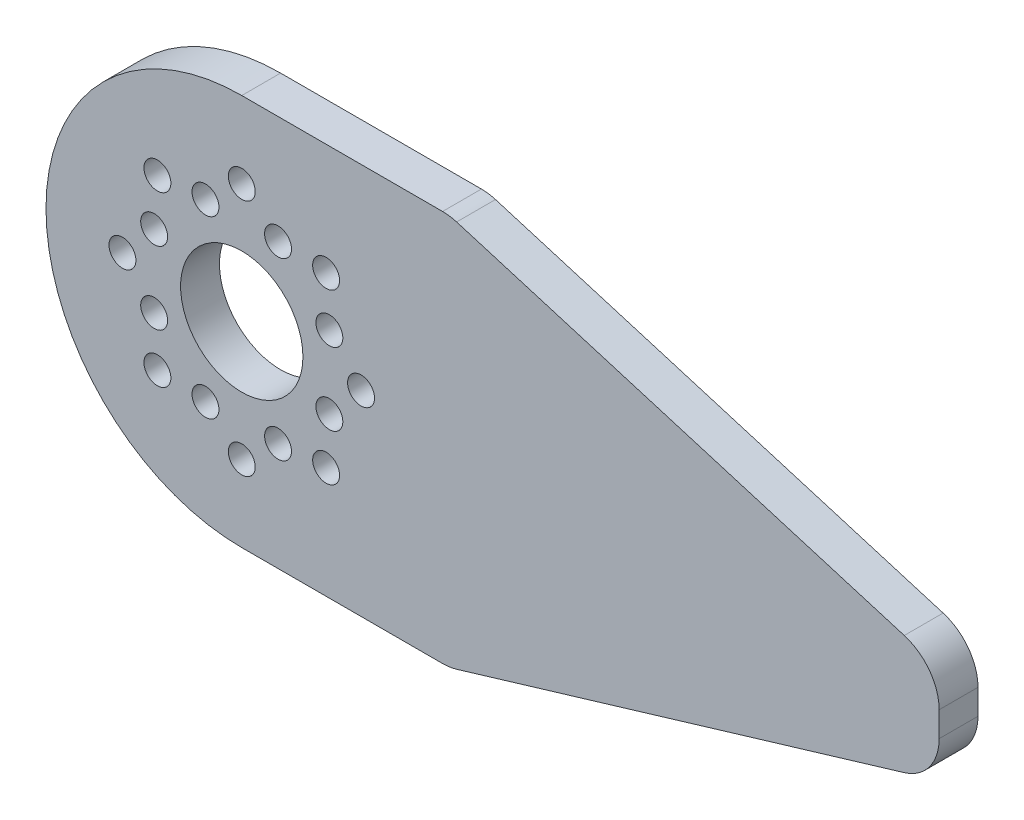
ISO-10303-21;
HEADER;
FILE_DESCRIPTION(('STEP AP214'),'2;1');
FILE_NAME('part.step','',(''),(''),'','','');
FILE_SCHEMA(('AUTOMOTIVE_DESIGN { 1 0 10303 214 1 1 1 1 }'));
ENDSEC;
DATA;
#1=APPLICATION_CONTEXT('core data for automotive mechanical design processes');
#2=APPLICATION_PROTOCOL_DEFINITION('international standard','automotive_design',2000,#1);
#3=PRODUCT_CONTEXT('',#1,'mechanical');
#4=PRODUCT('Part','Part','',(#3));
#5=PRODUCT_RELATED_PRODUCT_CATEGORY('part','',(#4));
#6=PRODUCT_DEFINITION_FORMATION('','',#4);
#7=PRODUCT_DEFINITION_CONTEXT('part definition',#1,'design');
#8=PRODUCT_DEFINITION('design','',#6,#7);
#9=PRODUCT_DEFINITION_SHAPE('','',#8);
#10=(LENGTH_UNIT() NAMED_UNIT(*) SI_UNIT(.MILLI.,.METRE.));
#11=(NAMED_UNIT(*) PLANE_ANGLE_UNIT() SI_UNIT($,.RADIAN.));
#12=(NAMED_UNIT(*) SI_UNIT($,.STERADIAN.) SOLID_ANGLE_UNIT());
#13=UNCERTAINTY_MEASURE_WITH_UNIT(LENGTH_MEASURE(1.E-05),#10,'distance_accuracy_value','');
#14=(GEOMETRIC_REPRESENTATION_CONTEXT(3) GLOBAL_UNCERTAINTY_ASSIGNED_CONTEXT((#13)) GLOBAL_UNIT_ASSIGNED_CONTEXT((#10,
#11,#12)) REPRESENTATION_CONTEXT('',''));
#15=CARTESIAN_POINT('',(0.,0.,0.));
#16=DIRECTION('',(0.,0.,1.));
#17=DIRECTION('',(1.,0.,0.));
#18=AXIS2_PLACEMENT_3D('',#15,#16,#17);
#19=CARTESIAN_POINT('',(19.,16.,3.175));
#20=DIRECTION('',(0.,0.,1.));
#21=DIRECTION('',(1.,0.,0.));
#22=AXIS2_PLACEMENT_3D('',#19,#20,#21);
#23=PLANE('',#22);
#24=DIRECTION('',(0.957826285221151,-0.287347885566345,0.));
#25=VECTOR('',#24,1.);
#26=CARTESIAN_POINT('',(76.,20.,3.175));
#27=LINE('',#26,#25);
#28=CARTESIAN_POINT('',(36.5623161970513,31.8313051408846,3.175));
#29=VERTEX_POINT('',#28);
#30=CARTESIAN_POINT('',(73.1493915422654,20.8551825373204,3.175));
#31=VERTEX_POINT('',#30);
#32=EDGE_CURVE('E198',#29,#31,#27,.T.);
#33=ORIENTED_EDGE('',*,*,#32,.F.);
#34=CARTESIAN_POINT('',(35.4129246547859,28.,3.175));
#35=DIRECTION('',(0.,0.,1.));
#36=DIRECTION('',(1.,0.,0.));
#37=AXIS2_PLACEMENT_3D('',#34,#35,#36);
#38=CIRCLE('',#37,4.);
#39=CARTESIAN_POINT('',(35.4129246547859,32.,3.175));
#40=VERTEX_POINT('',#39);
#41=EDGE_CURVE('E120',#29,#40,#38,.T.);
#42=ORIENTED_EDGE('',*,*,#41,.T.);
#43=DIRECTION('',(-1.,0.,0.));
#44=VECTOR('',#43,1.);
#45=CARTESIAN_POINT('',(19.,32.,3.175));
#46=LINE('',#45,#44);
#47=CARTESIAN_POINT('',(19.,32.,3.175));
#48=VERTEX_POINT('',#47);
#49=EDGE_CURVE('E112',#40,#48,#46,.T.);
#50=ORIENTED_EDGE('',*,*,#49,.T.);
#51=CARTESIAN_POINT('',(19.,16.,3.175));
#52=DIRECTION('',(0.,0.,1.));
#53=DIRECTION('',(1.,0.,0.));
#54=AXIS2_PLACEMENT_3D('',#51,#52,#53);
#55=CIRCLE('',#54,16.);
#56=CARTESIAN_POINT('',(19.,0.,3.175));
#57=VERTEX_POINT('',#56);
#58=EDGE_CURVE('E118',#48,#57,#55,.T.);
#59=ORIENTED_EDGE('',*,*,#58,.T.);
#60=DIRECTION('',(1.,0.,0.));
#61=VECTOR('',#60,1.);
#62=CARTESIAN_POINT('',(19.,0.,3.175));
#63=LINE('',#62,#61);
#64=CARTESIAN_POINT('',(35.4129246547859,0.,3.175));
#65=VERTEX_POINT('',#64);
#66=EDGE_CURVE('E138',#57,#65,#63,.T.);
#67=ORIENTED_EDGE('',*,*,#66,.T.);
#68=CARTESIAN_POINT('',(35.4129246547859,4.,3.175));
#69=DIRECTION('',(0.,0.,1.));
#70=DIRECTION('',(1.,0.,0.));
#71=AXIS2_PLACEMENT_3D('',#68,#69,#70);
#72=CIRCLE('',#71,4.);
#73=CARTESIAN_POINT('',(36.5623161970513,0.168694859115396,3.175));
#74=VERTEX_POINT('',#73);
#75=EDGE_CURVE('E161',#65,#74,#72,.T.);
#76=ORIENTED_EDGE('',*,*,#75,.T.);
#77=DIRECTION('',(-0.957826285221151,-0.287347885566345,0.));
#78=VECTOR('',#77,1.);
#79=CARTESIAN_POINT('',(76.,12.,3.175));
#80=LINE('',#79,#78);
#81=CARTESIAN_POINT('',(73.1493915422654,11.1448174626796,3.175));
#82=VERTEX_POINT('',#81);
#83=EDGE_CURVE('E195',#82,#74,#80,.T.);
#84=ORIENTED_EDGE('',*,*,#83,.F.);
#85=CARTESIAN_POINT('',(72.,14.9761226035642,3.175));
#86=DIRECTION('',(0.,0.,1.));
#87=DIRECTION('',(1.,0.,0.));
#88=AXIS2_PLACEMENT_3D('',#85,#86,#87);
#89=CIRCLE('',#88,4.);
#90=CARTESIAN_POINT('',(76.,14.9761226035642,3.175));
#91=VERTEX_POINT('',#90);
#92=EDGE_CURVE('E157',#82,#91,#89,.T.);
#93=ORIENTED_EDGE('',*,*,#92,.T.);
#94=DIRECTION('',(0.,1.,0.));
#95=VECTOR('',#94,1.);
#96=CARTESIAN_POINT('',(76.,0.,3.175));
#97=LINE('',#96,#95);
#98=CARTESIAN_POINT('',(76.,17.0238773964358,3.175));
#99=VERTEX_POINT('',#98);
#100=EDGE_CURVE('E123',#91,#99,#97,.T.);
#101=ORIENTED_EDGE('',*,*,#100,.T.);
#102=CARTESIAN_POINT('',(72.,17.0238773964358,3.175));
#103=DIRECTION('',(0.,0.,1.));
#104=DIRECTION('',(1.,0.,0.));
#105=AXIS2_PLACEMENT_3D('',#102,#103,#104);
#106=CIRCLE('',#105,4.);
#107=EDGE_CURVE('E159',#99,#31,#106,.T.);
#108=ORIENTED_EDGE('',*,*,#107,.T.);
#109=EDGE_LOOP('',(#33,#42,#50,#59,#67,#76,#84,#93,#101,#108));
#110=FACE_BOUND('',#109,.T.);
#111=CARTESIAN_POINT('',(11.8399336230385,18.9657966008286,3.175));
#112=DIRECTION('',(0.,0.,1.));
#113=DIRECTION('',(1.,0.,0.));
#114=AXIS2_PLACEMENT_3D('',#111,#112,#113);
#115=CIRCLE('',#114,1.1);
#116=CARTESIAN_POINT('',(12.9399336230385,18.9657966008286,3.175));
#117=VERTEX_POINT('',#116);
#118=EDGE_CURVE('E212',#117,#117,#115,.T.);
#119=ORIENTED_EDGE('',*,*,#118,.F.);
#120=EDGE_LOOP('',(#119));
#121=FACE_BOUND('',#120,.T.);
#122=CARTESIAN_POINT('',(16.0342033991723,8.83993362303764,3.175));
#123=DIRECTION('',(0.,0.,1.));
#124=DIRECTION('',(1.,0.,0.));
#125=AXIS2_PLACEMENT_3D('',#122,#123,#124);
#126=CIRCLE('',#125,1.1);
#127=CARTESIAN_POINT('',(17.1342033991723,8.83993362303764,3.175));
#128=VERTEX_POINT('',#127);
#129=EDGE_CURVE('E224',#128,#128,#126,.T.);
#130=ORIENTED_EDGE('',*,*,#129,.F.);
#131=EDGE_LOOP('',(#130));
#132=FACE_BOUND('',#131,.T.);
#133=CARTESIAN_POINT('',(26.1600663769633,13.0342033991715,3.175));
#134=DIRECTION('',(0.,0.,1.));
#135=DIRECTION('',(1.,0.,0.));
#136=AXIS2_PLACEMENT_3D('',#133,#134,#135);
#137=CIRCLE('',#136,1.1);
#138=CARTESIAN_POINT('',(27.2600663769633,13.0342033991715,3.175));
#139=VERTEX_POINT('',#138);
#140=EDGE_CURVE('E236',#139,#139,#137,.T.);
#141=ORIENTED_EDGE('',*,*,#140,.F.);
#142=EDGE_LOOP('',(#141));
#143=FACE_BOUND('',#142,.T.);
#144=CARTESIAN_POINT('',(21.9657966008295,23.1600663769625,3.175));
#145=DIRECTION('',(0.,0.,1.));
#146=DIRECTION('',(1.,0.,0.));
#147=AXIS2_PLACEMENT_3D('',#144,#145,#146);
#148=CIRCLE('',#147,1.1);
#149=CARTESIAN_POINT('',(23.0657966008295,23.1600663769625,3.175));
#150=VERTEX_POINT('',#149);
#151=EDGE_CURVE('E248',#150,#150,#148,.T.);
#152=ORIENTED_EDGE('',*,*,#151,.F.);
#153=EDGE_LOOP('',(#152));
#154=FACE_BOUND('',#153,.T.);
#155=CARTESIAN_POINT('',(9.25,16.,3.175));
#156=DIRECTION('',(0.,0.,1.));
#157=DIRECTION('',(1.,0.,0.));
#158=AXIS2_PLACEMENT_3D('',#155,#156,#157);
#159=CIRCLE('',#158,1.1);
#160=CARTESIAN_POINT('',(10.35,16.,3.175));
#161=VERTEX_POINT('',#160);
#162=EDGE_CURVE('E260',#161,#161,#159,.T.);
#163=ORIENTED_EDGE('',*,*,#162,.F.);
#164=EDGE_LOOP('',(#163));
#165=FACE_BOUND('',#164,.T.);
#166=CARTESIAN_POINT('',(19.,6.25,3.175));
#167=DIRECTION('',(0.,0.,1.));
#168=DIRECTION('',(1.,0.,0.));
#169=AXIS2_PLACEMENT_3D('',#166,#167,#168);
#170=CIRCLE('',#169,1.1);
#171=CARTESIAN_POINT('',(20.1,6.25,3.175));
#172=VERTEX_POINT('',#171);
#173=EDGE_CURVE('E272',#172,#172,#170,.T.);
#174=ORIENTED_EDGE('',*,*,#173,.F.);
#175=EDGE_LOOP('',(#174));
#176=FACE_BOUND('',#175,.T.);
#177=CARTESIAN_POINT('',(28.75,16.,3.175));
#178=DIRECTION('',(0.,0.,1.));
#179=DIRECTION('',(1.,0.,0.));
#180=AXIS2_PLACEMENT_3D('',#177,#178,#179);
#181=CIRCLE('',#180,1.1);
#182=CARTESIAN_POINT('',(29.85,16.,3.175));
#183=VERTEX_POINT('',#182);
#184=EDGE_CURVE('E284',#183,#183,#181,.T.);
#185=ORIENTED_EDGE('',*,*,#184,.F.);
#186=EDGE_LOOP('',(#185));
#187=FACE_BOUND('',#186,.T.);
#188=CARTESIAN_POINT('',(19.,16.,3.175));
#189=DIRECTION('',(0.,0.,1.));
#190=DIRECTION('',(1.,0.,0.));
#191=AXIS2_PLACEMENT_3D('',#188,#189,#190);
#192=CIRCLE('',#191,5.);
#193=CARTESIAN_POINT('',(24.,16.,3.175));
#194=VERTEX_POINT('',#193);
#195=EDGE_CURVE('E296',#194,#194,#192,.T.);
#196=ORIENTED_EDGE('',*,*,#195,.F.);
#197=EDGE_LOOP('',(#196));
#198=FACE_BOUND('',#197,.T.);
#199=CARTESIAN_POINT('',(19.,25.75,3.175));
#200=DIRECTION('',(0.,0.,1.));
#201=DIRECTION('',(1.,0.,0.));
#202=AXIS2_PLACEMENT_3D('',#199,#200,#201);
#203=CIRCLE('',#202,1.1);
#204=CARTESIAN_POINT('',(20.1,25.75,3.175));
#205=VERTEX_POINT('',#204);
#206=EDGE_CURVE('E146',#205,#205,#203,.T.);
#207=ORIENTED_EDGE('',*,*,#206,.F.);
#208=EDGE_LOOP('',(#207));
#209=FACE_BOUND('',#208,.T.);
#210=CARTESIAN_POINT('',(25.8942911165688,22.8942911165688,3.175));
#211=DIRECTION('',(0.,0.,1.));
#212=DIRECTION('',(1.,0.,0.));
#213=AXIS2_PLACEMENT_3D('',#210,#211,#212);
#214=CIRCLE('',#213,1.1);
#215=CARTESIAN_POINT('',(26.9942911165688,22.8942911165688,3.175));
#216=VERTEX_POINT('',#215);
#217=EDGE_CURVE('E290',#216,#216,#214,.T.);
#218=ORIENTED_EDGE('',*,*,#217,.F.);
#219=EDGE_LOOP('',(#218));
#220=FACE_BOUND('',#219,.T.);
#221=CARTESIAN_POINT('',(25.8942911165688,9.10570888343116,3.175));
#222=DIRECTION('',(0.,0.,1.));
#223=DIRECTION('',(1.,0.,0.));
#224=AXIS2_PLACEMENT_3D('',#221,#222,#223);
#225=CIRCLE('',#224,1.1);
#226=CARTESIAN_POINT('',(26.9942911165688,9.10570888343116,3.175));
#227=VERTEX_POINT('',#226);
#228=EDGE_CURVE('E278',#227,#227,#225,.T.);
#229=ORIENTED_EDGE('',*,*,#228,.F.);
#230=EDGE_LOOP('',(#229));
#231=FACE_BOUND('',#230,.T.);
#232=CARTESIAN_POINT('',(12.1057088834312,9.10570888343116,3.175));
#233=DIRECTION('',(0.,0.,1.));
#234=DIRECTION('',(1.,0.,0.));
#235=AXIS2_PLACEMENT_3D('',#232,#233,#234);
#236=CIRCLE('',#235,1.1);
#237=CARTESIAN_POINT('',(13.2057088834312,9.10570888343116,3.175));
#238=VERTEX_POINT('',#237);
#239=EDGE_CURVE('E266',#238,#238,#236,.T.);
#240=ORIENTED_EDGE('',*,*,#239,.F.);
#241=EDGE_LOOP('',(#240));
#242=FACE_BOUND('',#241,.T.);
#243=CARTESIAN_POINT('',(12.1057088834312,22.8942911165688,3.175));
#244=DIRECTION('',(0.,0.,1.));
#245=DIRECTION('',(1.,0.,0.));
#246=AXIS2_PLACEMENT_3D('',#243,#244,#245);
#247=CIRCLE('',#246,1.1);
#248=CARTESIAN_POINT('',(13.2057088834312,22.8942911165688,3.175));
#249=VERTEX_POINT('',#248);
#250=EDGE_CURVE('E254',#249,#249,#247,.T.);
#251=ORIENTED_EDGE('',*,*,#250,.F.);
#252=EDGE_LOOP('',(#251));
#253=FACE_BOUND('',#252,.T.);
#254=CARTESIAN_POINT('',(26.1600663769627,18.9657966008301,3.175));
#255=DIRECTION('',(0.,0.,1.));
#256=DIRECTION('',(1.,0.,0.));
#257=AXIS2_PLACEMENT_3D('',#254,#255,#256);
#258=CIRCLE('',#257,1.1);
#259=CARTESIAN_POINT('',(27.2600663769627,18.9657966008301,3.175));
#260=VERTEX_POINT('',#259);
#261=EDGE_CURVE('E242',#260,#260,#258,.T.);
#262=ORIENTED_EDGE('',*,*,#261,.F.);
#263=EDGE_LOOP('',(#262));
#264=FACE_BOUND('',#263,.T.);
#265=CARTESIAN_POINT('',(21.9657966008309,8.83993362303825,3.175));
#266=DIRECTION('',(0.,0.,1.));
#267=DIRECTION('',(1.,0.,0.));
#268=AXIS2_PLACEMENT_3D('',#265,#266,#267);
#269=CIRCLE('',#268,1.1);
#270=CARTESIAN_POINT('',(23.0657966008309,8.83993362303825,3.175));
#271=VERTEX_POINT('',#270);
#272=EDGE_CURVE('E230',#271,#271,#269,.T.);
#273=ORIENTED_EDGE('',*,*,#272,.F.);
#274=EDGE_LOOP('',(#273));
#275=FACE_BOUND('',#274,.T.);
#276=CARTESIAN_POINT('',(11.8399336230391,13.03420339917,3.175));
#277=DIRECTION('',(0.,0.,1.));
#278=DIRECTION('',(1.,0.,0.));
#279=AXIS2_PLACEMENT_3D('',#276,#277,#278);
#280=CIRCLE('',#279,1.1);
#281=CARTESIAN_POINT('',(12.9399336230391,13.03420339917,3.175));
#282=VERTEX_POINT('',#281);
#283=EDGE_CURVE('E218',#282,#282,#280,.T.);
#284=ORIENTED_EDGE('',*,*,#283,.F.);
#285=EDGE_LOOP('',(#284));
#286=FACE_BOUND('',#285,.T.);
#287=CARTESIAN_POINT('',(16.0342033991709,23.1600663769619,3.175));
#288=DIRECTION('',(0.,0.,1.));
#289=DIRECTION('',(1.,0.,0.));
#290=AXIS2_PLACEMENT_3D('',#287,#288,#289);
#291=CIRCLE('',#290,1.1);
#292=CARTESIAN_POINT('',(17.1342033991709,23.1600663769619,3.175));
#293=VERTEX_POINT('',#292);
#294=EDGE_CURVE('E206',#293,#293,#291,.T.);
#295=ORIENTED_EDGE('',*,*,#294,.F.);
#296=EDGE_LOOP('',(#295));
#297=FACE_BOUND('',#296,.T.);
#298=ADVANCED_FACE('F33',(#110,#121,#132,#143,#154,#165,#176,#187,#198,#209,#220,#231,#242,#253,
#264,#275,#286,#297),#23,.T.);
#299=CARTESIAN_POINT('',(19.,16.,0.));
#300=DIRECTION('',(0.,0.,1.));
#301=DIRECTION('',(1.,0.,0.));
#302=AXIS2_PLACEMENT_3D('',#299,#300,#301);
#303=PLANE('',#302);
#304=CARTESIAN_POINT('',(11.8399336230385,18.9657966008286,0.));
#305=DIRECTION('',(0.,0.,1.));
#306=DIRECTION('',(1.,0.,0.));
#307=AXIS2_PLACEMENT_3D('',#304,#305,#306);
#308=CIRCLE('',#307,1.1);
#309=CARTESIAN_POINT('',(12.9399336230385,18.9657966008286,0.));
#310=VERTEX_POINT('',#309);
#311=EDGE_CURVE('E209',#310,#310,#308,.T.);
#312=ORIENTED_EDGE('',*,*,#311,.T.);
#313=EDGE_LOOP('',(#312));
#314=FACE_BOUND('',#313,.T.);
#315=CARTESIAN_POINT('',(16.0342033991723,8.83993362303764,0.));
#316=DIRECTION('',(0.,0.,1.));
#317=DIRECTION('',(1.,0.,0.));
#318=AXIS2_PLACEMENT_3D('',#315,#316,#317);
#319=CIRCLE('',#318,1.1);
#320=CARTESIAN_POINT('',(17.1342033991723,8.83993362303764,0.));
#321=VERTEX_POINT('',#320);
#322=EDGE_CURVE('E221',#321,#321,#319,.T.);
#323=ORIENTED_EDGE('',*,*,#322,.T.);
#324=EDGE_LOOP('',(#323));
#325=FACE_BOUND('',#324,.T.);
#326=CARTESIAN_POINT('',(26.1600663769633,13.0342033991715,0.));
#327=DIRECTION('',(0.,0.,1.));
#328=DIRECTION('',(1.,0.,0.));
#329=AXIS2_PLACEMENT_3D('',#326,#327,#328);
#330=CIRCLE('',#329,1.1);
#331=CARTESIAN_POINT('',(27.2600663769633,13.0342033991715,0.));
#332=VERTEX_POINT('',#331);
#333=EDGE_CURVE('E233',#332,#332,#330,.T.);
#334=ORIENTED_EDGE('',*,*,#333,.T.);
#335=EDGE_LOOP('',(#334));
#336=FACE_BOUND('',#335,.T.);
#337=CARTESIAN_POINT('',(21.9657966008295,23.1600663769625,0.));
#338=DIRECTION('',(0.,0.,1.));
#339=DIRECTION('',(1.,0.,0.));
#340=AXIS2_PLACEMENT_3D('',#337,#338,#339);
#341=CIRCLE('',#340,1.1);
#342=CARTESIAN_POINT('',(23.0657966008295,23.1600663769625,0.));
#343=VERTEX_POINT('',#342);
#344=EDGE_CURVE('E245',#343,#343,#341,.T.);
#345=ORIENTED_EDGE('',*,*,#344,.T.);
#346=EDGE_LOOP('',(#345));
#347=FACE_BOUND('',#346,.T.);
#348=CARTESIAN_POINT('',(9.25,16.,0.));
#349=DIRECTION('',(0.,0.,1.));
#350=DIRECTION('',(1.,0.,0.));
#351=AXIS2_PLACEMENT_3D('',#348,#349,#350);
#352=CIRCLE('',#351,1.1);
#353=CARTESIAN_POINT('',(10.35,16.,0.));
#354=VERTEX_POINT('',#353);
#355=EDGE_CURVE('E257',#354,#354,#352,.T.);
#356=ORIENTED_EDGE('',*,*,#355,.T.);
#357=EDGE_LOOP('',(#356));
#358=FACE_BOUND('',#357,.T.);
#359=CARTESIAN_POINT('',(19.,6.25,0.));
#360=DIRECTION('',(0.,0.,1.));
#361=DIRECTION('',(1.,0.,0.));
#362=AXIS2_PLACEMENT_3D('',#359,#360,#361);
#363=CIRCLE('',#362,1.1);
#364=CARTESIAN_POINT('',(20.1,6.25,0.));
#365=VERTEX_POINT('',#364);
#366=EDGE_CURVE('E269',#365,#365,#363,.T.);
#367=ORIENTED_EDGE('',*,*,#366,.T.);
#368=EDGE_LOOP('',(#367));
#369=FACE_BOUND('',#368,.T.);
#370=CARTESIAN_POINT('',(28.75,16.,0.));
#371=DIRECTION('',(0.,0.,1.));
#372=DIRECTION('',(1.,0.,0.));
#373=AXIS2_PLACEMENT_3D('',#370,#371,#372);
#374=CIRCLE('',#373,1.1);
#375=CARTESIAN_POINT('',(29.85,16.,0.));
#376=VERTEX_POINT('',#375);
#377=EDGE_CURVE('E281',#376,#376,#374,.T.);
#378=ORIENTED_EDGE('',*,*,#377,.T.);
#379=EDGE_LOOP('',(#378));
#380=FACE_BOUND('',#379,.T.);
#381=CARTESIAN_POINT('',(19.,16.,0.));
#382=DIRECTION('',(0.,0.,1.));
#383=DIRECTION('',(1.,0.,0.));
#384=AXIS2_PLACEMENT_3D('',#381,#382,#383);
#385=CIRCLE('',#384,5.);
#386=CARTESIAN_POINT('',(24.,16.,0.));
#387=VERTEX_POINT('',#386);
#388=EDGE_CURVE('E293',#387,#387,#385,.T.);
#389=ORIENTED_EDGE('',*,*,#388,.T.);
#390=EDGE_LOOP('',(#389));
#391=FACE_BOUND('',#390,.T.);
#392=DIRECTION('',(-1.,0.,0.));
#393=VECTOR('',#392,1.);
#394=CARTESIAN_POINT('',(19.,32.,0.));
#395=LINE('',#394,#393);
#396=CARTESIAN_POINT('',(35.4129246547859,32.,0.));
#397=VERTEX_POINT('',#396);
#398=CARTESIAN_POINT('',(19.,32.,0.));
#399=VERTEX_POINT('',#398);
#400=EDGE_CURVE('E129',#397,#399,#395,.T.);
#401=ORIENTED_EDGE('',*,*,#400,.F.);
#402=CARTESIAN_POINT('',(35.4129246547859,28.,0.));
#403=DIRECTION('',(0.,0.,1.));
#404=DIRECTION('',(1.,0.,0.));
#405=AXIS2_PLACEMENT_3D('',#402,#403,#404);
#406=CIRCLE('',#405,4.);
#407=CARTESIAN_POINT('',(36.5623161970513,31.8313051408846,0.));
#408=VERTEX_POINT('',#407);
#409=EDGE_CURVE('E171',#397,#408,#406,.F.);
#410=ORIENTED_EDGE('',*,*,#409,.T.);
#411=DIRECTION('',(0.957826285221151,-0.287347885566345,0.));
#412=VECTOR('',#411,1.);
#413=CARTESIAN_POINT('',(76.,20.,0.));
#414=LINE('',#413,#412);
#415=CARTESIAN_POINT('',(73.1493915422654,20.8551825373204,0.));
#416=VERTEX_POINT('',#415);
#417=EDGE_CURVE('E201',#408,#416,#414,.T.);
#418=ORIENTED_EDGE('',*,*,#417,.T.);
#419=CARTESIAN_POINT('',(72.,17.0238773964358,0.));
#420=DIRECTION('',(0.,0.,1.));
#421=DIRECTION('',(1.,0.,0.));
#422=AXIS2_PLACEMENT_3D('',#419,#420,#421);
#423=CIRCLE('',#422,4.);
#424=CARTESIAN_POINT('',(76.,17.0238773964358,0.));
#425=VERTEX_POINT('',#424);
#426=EDGE_CURVE('E168',#416,#425,#423,.F.);
#427=ORIENTED_EDGE('',*,*,#426,.T.);
#428=DIRECTION('',(0.,1.,0.));
#429=VECTOR('',#428,1.);
#430=CARTESIAN_POINT('',(76.,0.,0.));
#431=LINE('',#430,#429);
#432=CARTESIAN_POINT('',(76.,14.9761226035642,0.));
#433=VERTEX_POINT('',#432);
#434=EDGE_CURVE('E143',#433,#425,#431,.T.);
#435=ORIENTED_EDGE('',*,*,#434,.F.);
#436=CARTESIAN_POINT('',(72.,14.9761226035642,0.));
#437=DIRECTION('',(0.,0.,1.));
#438=DIRECTION('',(1.,0.,0.));
#439=AXIS2_PLACEMENT_3D('',#436,#437,#438);
#440=CIRCLE('',#439,4.);
#441=CARTESIAN_POINT('',(73.1493915422654,11.1448174626796,0.));
#442=VERTEX_POINT('',#441);
#443=EDGE_CURVE('E166',#433,#442,#440,.F.);
#444=ORIENTED_EDGE('',*,*,#443,.T.);
#445=DIRECTION('',(-0.957826285221151,-0.287347885566345,0.));
#446=VECTOR('',#445,1.);
#447=CARTESIAN_POINT('',(76.,12.,0.));
#448=LINE('',#447,#446);
#449=CARTESIAN_POINT('',(36.5623161970513,0.168694859115396,0.));
#450=VERTEX_POINT('',#449);
#451=EDGE_CURVE('E196',#442,#450,#448,.T.);
#452=ORIENTED_EDGE('',*,*,#451,.T.);
#453=CARTESIAN_POINT('',(35.4129246547859,4.,0.));
#454=DIRECTION('',(0.,0.,1.));
#455=DIRECTION('',(1.,0.,0.));
#456=AXIS2_PLACEMENT_3D('',#453,#454,#455);
#457=CIRCLE('',#456,4.);
#458=CARTESIAN_POINT('',(35.4129246547859,0.,0.));
#459=VERTEX_POINT('',#458);
#460=EDGE_CURVE('E48',#450,#459,#457,.F.);
#461=ORIENTED_EDGE('',*,*,#460,.T.);
#462=DIRECTION('',(1.,0.,0.));
#463=VECTOR('',#462,1.);
#464=CARTESIAN_POINT('',(19.,0.,0.));
#465=LINE('',#464,#463);
#466=CARTESIAN_POINT('',(19.,0.,0.));
#467=VERTEX_POINT('',#466);
#468=EDGE_CURVE('E150',#467,#459,#465,.T.);
#469=ORIENTED_EDGE('',*,*,#468,.F.);
#470=CARTESIAN_POINT('',(19.,16.,0.));
#471=DIRECTION('',(0.,0.,1.));
#472=DIRECTION('',(1.,0.,0.));
#473=AXIS2_PLACEMENT_3D('',#470,#471,#472);
#474=CIRCLE('',#473,16.);
#475=EDGE_CURVE('E148',#399,#467,#474,.T.);
#476=ORIENTED_EDGE('',*,*,#475,.F.);
#477=EDGE_LOOP('',(#401,#410,#418,#427,#435,#444,#452,#461,#469,#476));
#478=FACE_BOUND('',#477,.T.);
#479=CARTESIAN_POINT('',(19.,25.75,0.));
#480=DIRECTION('',(0.,0.,1.));
#481=DIRECTION('',(1.,0.,0.));
#482=AXIS2_PLACEMENT_3D('',#479,#480,#481);
#483=CIRCLE('',#482,1.1);
#484=CARTESIAN_POINT('',(20.1,25.75,0.));
#485=VERTEX_POINT('',#484);
#486=EDGE_CURVE('E299',#485,#485,#483,.T.);
#487=ORIENTED_EDGE('',*,*,#486,.T.);
#488=EDGE_LOOP('',(#487));
#489=FACE_BOUND('',#488,.T.);
#490=CARTESIAN_POINT('',(25.8942911165688,22.8942911165688,0.));
#491=DIRECTION('',(0.,0.,1.));
#492=DIRECTION('',(1.,0.,0.));
#493=AXIS2_PLACEMENT_3D('',#490,#491,#492);
#494=CIRCLE('',#493,1.1);
#495=CARTESIAN_POINT('',(26.9942911165688,22.8942911165688,0.));
#496=VERTEX_POINT('',#495);
#497=EDGE_CURVE('E287',#496,#496,#494,.T.);
#498=ORIENTED_EDGE('',*,*,#497,.T.);
#499=EDGE_LOOP('',(#498));
#500=FACE_BOUND('',#499,.T.);
#501=CARTESIAN_POINT('',(25.8942911165688,9.10570888343116,0.));
#502=DIRECTION('',(0.,0.,1.));
#503=DIRECTION('',(1.,0.,0.));
#504=AXIS2_PLACEMENT_3D('',#501,#502,#503);
#505=CIRCLE('',#504,1.1);
#506=CARTESIAN_POINT('',(26.9942911165688,9.10570888343116,0.));
#507=VERTEX_POINT('',#506);
#508=EDGE_CURVE('E275',#507,#507,#505,.T.);
#509=ORIENTED_EDGE('',*,*,#508,.T.);
#510=EDGE_LOOP('',(#509));
#511=FACE_BOUND('',#510,.T.);
#512=CARTESIAN_POINT('',(12.1057088834312,9.10570888343116,0.));
#513=DIRECTION('',(0.,0.,1.));
#514=DIRECTION('',(1.,0.,0.));
#515=AXIS2_PLACEMENT_3D('',#512,#513,#514);
#516=CIRCLE('',#515,1.1);
#517=CARTESIAN_POINT('',(13.2057088834312,9.10570888343116,0.));
#518=VERTEX_POINT('',#517);
#519=EDGE_CURVE('E263',#518,#518,#516,.T.);
#520=ORIENTED_EDGE('',*,*,#519,.T.);
#521=EDGE_LOOP('',(#520));
#522=FACE_BOUND('',#521,.T.);
#523=CARTESIAN_POINT('',(12.1057088834312,22.8942911165688,0.));
#524=DIRECTION('',(0.,0.,1.));
#525=DIRECTION('',(1.,0.,0.));
#526=AXIS2_PLACEMENT_3D('',#523,#524,#525);
#527=CIRCLE('',#526,1.1);
#528=CARTESIAN_POINT('',(13.2057088834312,22.8942911165688,0.));
#529=VERTEX_POINT('',#528);
#530=EDGE_CURVE('E251',#529,#529,#527,.T.);
#531=ORIENTED_EDGE('',*,*,#530,.T.);
#532=EDGE_LOOP('',(#531));
#533=FACE_BOUND('',#532,.T.);
#534=CARTESIAN_POINT('',(26.1600663769627,18.9657966008301,0.));
#535=DIRECTION('',(0.,0.,1.));
#536=DIRECTION('',(1.,0.,0.));
#537=AXIS2_PLACEMENT_3D('',#534,#535,#536);
#538=CIRCLE('',#537,1.1);
#539=CARTESIAN_POINT('',(27.2600663769627,18.9657966008301,0.));
#540=VERTEX_POINT('',#539);
#541=EDGE_CURVE('E239',#540,#540,#538,.T.);
#542=ORIENTED_EDGE('',*,*,#541,.T.);
#543=EDGE_LOOP('',(#542));
#544=FACE_BOUND('',#543,.T.);
#545=CARTESIAN_POINT('',(21.9657966008309,8.83993362303825,0.));
#546=DIRECTION('',(0.,0.,1.));
#547=DIRECTION('',(1.,0.,0.));
#548=AXIS2_PLACEMENT_3D('',#545,#546,#547);
#549=CIRCLE('',#548,1.1);
#550=CARTESIAN_POINT('',(23.0657966008309,8.83993362303825,0.));
#551=VERTEX_POINT('',#550);
#552=EDGE_CURVE('E227',#551,#551,#549,.T.);
#553=ORIENTED_EDGE('',*,*,#552,.T.);
#554=EDGE_LOOP('',(#553));
#555=FACE_BOUND('',#554,.T.);
#556=CARTESIAN_POINT('',(11.8399336230391,13.03420339917,0.));
#557=DIRECTION('',(0.,0.,1.));
#558=DIRECTION('',(1.,0.,0.));
#559=AXIS2_PLACEMENT_3D('',#556,#557,#558);
#560=CIRCLE('',#559,1.1);
#561=CARTESIAN_POINT('',(12.9399336230391,13.03420339917,0.));
#562=VERTEX_POINT('',#561);
#563=EDGE_CURVE('E215',#562,#562,#560,.T.);
#564=ORIENTED_EDGE('',*,*,#563,.T.);
#565=EDGE_LOOP('',(#564));
#566=FACE_BOUND('',#565,.T.);
#567=CARTESIAN_POINT('',(16.0342033991709,23.1600663769619,0.));
#568=DIRECTION('',(0.,0.,1.));
#569=DIRECTION('',(1.,0.,0.));
#570=AXIS2_PLACEMENT_3D('',#567,#568,#569);
#571=CIRCLE('',#570,1.1);
#572=CARTESIAN_POINT('',(17.1342033991709,23.1600663769619,0.));
#573=VERTEX_POINT('',#572);
#574=EDGE_CURVE('E203',#573,#573,#571,.T.);
#575=ORIENTED_EDGE('',*,*,#574,.T.);
#576=EDGE_LOOP('',(#575));
#577=FACE_BOUND('',#576,.T.);
#578=ADVANCED_FACE('F188',(#314,#325,#336,#347,#358,#369,#380,#391,#478,#489,#500,#511,#522,
#533,#544,#555,#566,#577),#303,.F.);
#579=CARTESIAN_POINT('',(76.,0.,3.175));
#580=DIRECTION('',(-1.,0.,0.));
#581=DIRECTION('',(0.,-1.,0.));
#582=AXIS2_PLACEMENT_3D('',#579,#580,#581);
#583=PLANE('',#582);
#584=ORIENTED_EDGE('',*,*,#434,.T.);
#585=DIRECTION('',(0.,0.,1.));
#586=VECTOR('',#585,1.);
#587=CARTESIAN_POINT('',(76.,17.0238773964358,3.175));
#588=LINE('',#587,#586);
#589=EDGE_CURVE('E11',#425,#99,#588,.T.);
#590=ORIENTED_EDGE('',*,*,#589,.T.);
#591=ORIENTED_EDGE('',*,*,#100,.F.);
#592=DIRECTION('',(0.,0.,1.));
#593=VECTOR('',#592,1.);
#594=CARTESIAN_POINT('',(76.,14.9761226035642,3.175));
#595=LINE('',#594,#593);
#596=EDGE_CURVE('E41',#91,#433,#595,.F.);
#597=ORIENTED_EDGE('',*,*,#596,.T.);
#598=EDGE_LOOP('',(#584,#590,#591,#597));
#599=FACE_BOUND('',#598,.T.);
#600=ADVANCED_FACE('F183',(#599),#583,.F.);
#601=CARTESIAN_POINT('',(19.,32.,3.175));
#602=DIRECTION('',(0.,-1.,0.));
#603=DIRECTION('',(0.,0.,-1.));
#604=AXIS2_PLACEMENT_3D('',#601,#602,#603);
#605=PLANE('',#604);
#606=ORIENTED_EDGE('',*,*,#49,.F.);
#607=DIRECTION('',(0.,0.,1.));
#608=VECTOR('',#607,1.);
#609=CARTESIAN_POINT('',(35.4129246547859,32.,3.175));
#610=LINE('',#609,#608);
#611=EDGE_CURVE('E164',#40,#397,#610,.F.);
#612=ORIENTED_EDGE('',*,*,#611,.T.);
#613=ORIENTED_EDGE('',*,*,#400,.T.);
#614=DIRECTION('',(0.,0.,-1.));
#615=VECTOR('',#614,1.);
#616=CARTESIAN_POINT('',(19.,32.,3.175));
#617=LINE('',#616,#615);
#618=EDGE_CURVE('E126',#48,#399,#617,.T.);
#619=ORIENTED_EDGE('',*,*,#618,.F.);
#620=EDGE_LOOP('',(#606,#612,#613,#619));
#621=FACE_BOUND('',#620,.T.);
#622=ADVANCED_FACE('F127',(#621),#605,.F.);
#623=CARTESIAN_POINT('',(19.,16.,3.175));
#624=DIRECTION('',(0.,0.,-1.));
#625=DIRECTION('',(-1.,0.,0.));
#626=AXIS2_PLACEMENT_3D('',#623,#624,#625);
#627=CYLINDRICAL_SURFACE('',#626,16.);
#628=ORIENTED_EDGE('',*,*,#475,.T.);
#629=DIRECTION('',(0.,0.,-1.));
#630=VECTOR('',#629,1.);
#631=CARTESIAN_POINT('',(19.,0.,3.175));
#632=LINE('',#631,#630);
#633=EDGE_CURVE('E133',#57,#467,#632,.T.);
#634=ORIENTED_EDGE('',*,*,#633,.F.);
#635=ORIENTED_EDGE('',*,*,#58,.F.);
#636=ORIENTED_EDGE('',*,*,#618,.T.);
#637=EDGE_LOOP('',(#628,#634,#635,#636));
#638=FACE_BOUND('',#637,.T.);
#639=ADVANCED_FACE('F135',(#638),#627,.T.);
#640=CARTESIAN_POINT('',(19.,0.,3.175));
#641=DIRECTION('',(0.,1.,0.));
#642=DIRECTION('',(0.,0.,1.));
#643=AXIS2_PLACEMENT_3D('',#640,#641,#642);
#644=PLANE('',#643);
#645=ORIENTED_EDGE('',*,*,#468,.T.);
#646=DIRECTION('',(0.,0.,1.));
#647=VECTOR('',#646,1.);
#648=CARTESIAN_POINT('',(35.4129246547859,0.,3.175));
#649=LINE('',#648,#647);
#650=EDGE_CURVE('E173',#459,#65,#649,.T.);
#651=ORIENTED_EDGE('',*,*,#650,.T.);
#652=ORIENTED_EDGE('',*,*,#66,.F.);
#653=ORIENTED_EDGE('',*,*,#633,.T.);
#654=EDGE_LOOP('',(#645,#651,#652,#653));
#655=FACE_BOUND('',#654,.T.);
#656=ADVANCED_FACE('F333',(#655),#644,.F.);
#657=CARTESIAN_POINT('',(19.,25.75,3.175));
#658=DIRECTION('',(0.,0.,-1.));
#659=DIRECTION('',(-1.,0.,0.));
#660=AXIS2_PLACEMENT_3D('',#657,#658,#659);
#661=CYLINDRICAL_SURFACE('',#660,1.1);
#662=ORIENTED_EDGE('',*,*,#206,.T.);
#663=EDGE_LOOP('',(#662));
#664=FACE_BOUND('',#663,.T.);
#665=ORIENTED_EDGE('',*,*,#486,.F.);
#666=EDGE_LOOP('',(#665));
#667=FACE_BOUND('',#666,.T.);
#668=ADVANCED_FACE('F330',(#664,#667),#661,.F.);
#669=CARTESIAN_POINT('',(19.,16.,3.175));
#670=DIRECTION('',(0.,0.,-1.));
#671=DIRECTION('',(-1.,0.,0.));
#672=AXIS2_PLACEMENT_3D('',#669,#670,#671);
#673=CYLINDRICAL_SURFACE('',#672,5.);
#674=ORIENTED_EDGE('',*,*,#195,.T.);
#675=EDGE_LOOP('',(#674));
#676=FACE_BOUND('',#675,.T.);
#677=ORIENTED_EDGE('',*,*,#388,.F.);
#678=EDGE_LOOP('',(#677));
#679=FACE_BOUND('',#678,.T.);
#680=ADVANCED_FACE('F414',(#676,#679),#673,.F.);
#681=CARTESIAN_POINT('',(25.8942911165688,22.8942911165688,3.175));
#682=DIRECTION('',(0.,0.,-1.));
#683=DIRECTION('',(-1.,0.,0.));
#684=AXIS2_PLACEMENT_3D('',#681,#682,#683);
#685=CYLINDRICAL_SURFACE('',#684,1.1);
#686=ORIENTED_EDGE('',*,*,#217,.T.);
#687=EDGE_LOOP('',(#686));
#688=FACE_BOUND('',#687,.T.);
#689=ORIENTED_EDGE('',*,*,#497,.F.);
#690=EDGE_LOOP('',(#689));
#691=FACE_BOUND('',#690,.T.);
#692=ADVANCED_FACE('F411',(#688,#691),#685,.F.);
#693=CARTESIAN_POINT('',(28.75,16.,3.175));
#694=DIRECTION('',(0.,0.,-1.));
#695=DIRECTION('',(-1.,0.,0.));
#696=AXIS2_PLACEMENT_3D('',#693,#694,#695);
#697=CYLINDRICAL_SURFACE('',#696,1.1);
#698=ORIENTED_EDGE('',*,*,#184,.T.);
#699=EDGE_LOOP('',(#698));
#700=FACE_BOUND('',#699,.T.);
#701=ORIENTED_EDGE('',*,*,#377,.F.);
#702=EDGE_LOOP('',(#701));
#703=FACE_BOUND('',#702,.T.);
#704=ADVANCED_FACE('F407',(#700,#703),#697,.F.);
#705=CARTESIAN_POINT('',(25.8942911165688,9.10570888343116,3.175));
#706=DIRECTION('',(0.,0.,-1.));
#707=DIRECTION('',(-1.,0.,0.));
#708=AXIS2_PLACEMENT_3D('',#705,#706,#707);
#709=CYLINDRICAL_SURFACE('',#708,1.1);
#710=ORIENTED_EDGE('',*,*,#228,.T.);
#711=EDGE_LOOP('',(#710));
#712=FACE_BOUND('',#711,.T.);
#713=ORIENTED_EDGE('',*,*,#508,.F.);
#714=EDGE_LOOP('',(#713));
#715=FACE_BOUND('',#714,.T.);
#716=ADVANCED_FACE('F403',(#712,#715),#709,.F.);
#717=CARTESIAN_POINT('',(19.,6.25,3.175));
#718=DIRECTION('',(0.,0.,-1.));
#719=DIRECTION('',(-1.,0.,0.));
#720=AXIS2_PLACEMENT_3D('',#717,#718,#719);
#721=CYLINDRICAL_SURFACE('',#720,1.1);
#722=ORIENTED_EDGE('',*,*,#173,.T.);
#723=EDGE_LOOP('',(#722));
#724=FACE_BOUND('',#723,.T.);
#725=ORIENTED_EDGE('',*,*,#366,.F.);
#726=EDGE_LOOP('',(#725));
#727=FACE_BOUND('',#726,.T.);
#728=ADVANCED_FACE('F399',(#724,#727),#721,.F.);
#729=CARTESIAN_POINT('',(12.1057088834312,9.10570888343116,3.175));
#730=DIRECTION('',(0.,0.,-1.));
#731=DIRECTION('',(-1.,0.,0.));
#732=AXIS2_PLACEMENT_3D('',#729,#730,#731);
#733=CYLINDRICAL_SURFACE('',#732,1.1);
#734=ORIENTED_EDGE('',*,*,#239,.T.);
#735=EDGE_LOOP('',(#734));
#736=FACE_BOUND('',#735,.T.);
#737=ORIENTED_EDGE('',*,*,#519,.F.);
#738=EDGE_LOOP('',(#737));
#739=FACE_BOUND('',#738,.T.);
#740=ADVANCED_FACE('F395',(#736,#739),#733,.F.);
#741=CARTESIAN_POINT('',(9.25,16.,3.175));
#742=DIRECTION('',(0.,0.,-1.));
#743=DIRECTION('',(-1.,0.,0.));
#744=AXIS2_PLACEMENT_3D('',#741,#742,#743);
#745=CYLINDRICAL_SURFACE('',#744,1.1);
#746=ORIENTED_EDGE('',*,*,#162,.T.);
#747=EDGE_LOOP('',(#746));
#748=FACE_BOUND('',#747,.T.);
#749=ORIENTED_EDGE('',*,*,#355,.F.);
#750=EDGE_LOOP('',(#749));
#751=FACE_BOUND('',#750,.T.);
#752=ADVANCED_FACE('F391',(#748,#751),#745,.F.);
#753=CARTESIAN_POINT('',(12.1057088834312,22.8942911165688,3.175));
#754=DIRECTION('',(0.,0.,-1.));
#755=DIRECTION('',(-1.,0.,0.));
#756=AXIS2_PLACEMENT_3D('',#753,#754,#755);
#757=CYLINDRICAL_SURFACE('',#756,1.1);
#758=ORIENTED_EDGE('',*,*,#250,.T.);
#759=EDGE_LOOP('',(#758));
#760=FACE_BOUND('',#759,.T.);
#761=ORIENTED_EDGE('',*,*,#530,.F.);
#762=EDGE_LOOP('',(#761));
#763=FACE_BOUND('',#762,.T.);
#764=ADVANCED_FACE('F387',(#760,#763),#757,.F.);
#765=CARTESIAN_POINT('',(21.9657966008295,23.1600663769625,3.175));
#766=DIRECTION('',(0.,0.,-1.));
#767=DIRECTION('',(-1.,0.,0.));
#768=AXIS2_PLACEMENT_3D('',#765,#766,#767);
#769=CYLINDRICAL_SURFACE('',#768,1.1);
#770=ORIENTED_EDGE('',*,*,#151,.T.);
#771=EDGE_LOOP('',(#770));
#772=FACE_BOUND('',#771,.T.);
#773=ORIENTED_EDGE('',*,*,#344,.F.);
#774=EDGE_LOOP('',(#773));
#775=FACE_BOUND('',#774,.T.);
#776=ADVANCED_FACE('F383',(#772,#775),#769,.F.);
#777=CARTESIAN_POINT('',(26.1600663769627,18.9657966008301,3.175));
#778=DIRECTION('',(0.,0.,-1.));
#779=DIRECTION('',(-1.,0.,0.));
#780=AXIS2_PLACEMENT_3D('',#777,#778,#779);
#781=CYLINDRICAL_SURFACE('',#780,1.1);
#782=ORIENTED_EDGE('',*,*,#261,.T.);
#783=EDGE_LOOP('',(#782));
#784=FACE_BOUND('',#783,.T.);
#785=ORIENTED_EDGE('',*,*,#541,.F.);
#786=EDGE_LOOP('',(#785));
#787=FACE_BOUND('',#786,.T.);
#788=ADVANCED_FACE('F379',(#784,#787),#781,.F.);
#789=CARTESIAN_POINT('',(26.1600663769633,13.0342033991715,3.175));
#790=DIRECTION('',(0.,0.,-1.));
#791=DIRECTION('',(-1.,0.,0.));
#792=AXIS2_PLACEMENT_3D('',#789,#790,#791);
#793=CYLINDRICAL_SURFACE('',#792,1.1);
#794=ORIENTED_EDGE('',*,*,#140,.T.);
#795=EDGE_LOOP('',(#794));
#796=FACE_BOUND('',#795,.T.);
#797=ORIENTED_EDGE('',*,*,#333,.F.);
#798=EDGE_LOOP('',(#797));
#799=FACE_BOUND('',#798,.T.);
#800=ADVANCED_FACE('F375',(#796,#799),#793,.F.);
#801=CARTESIAN_POINT('',(21.9657966008309,8.83993362303825,3.175));
#802=DIRECTION('',(0.,0.,-1.));
#803=DIRECTION('',(-1.,0.,0.));
#804=AXIS2_PLACEMENT_3D('',#801,#802,#803);
#805=CYLINDRICAL_SURFACE('',#804,1.1);
#806=ORIENTED_EDGE('',*,*,#272,.T.);
#807=EDGE_LOOP('',(#806));
#808=FACE_BOUND('',#807,.T.);
#809=ORIENTED_EDGE('',*,*,#552,.F.);
#810=EDGE_LOOP('',(#809));
#811=FACE_BOUND('',#810,.T.);
#812=ADVANCED_FACE('F371',(#808,#811),#805,.F.);
#813=CARTESIAN_POINT('',(16.0342033991723,8.83993362303764,3.175));
#814=DIRECTION('',(0.,0.,-1.));
#815=DIRECTION('',(-1.,0.,0.));
#816=AXIS2_PLACEMENT_3D('',#813,#814,#815);
#817=CYLINDRICAL_SURFACE('',#816,1.1);
#818=ORIENTED_EDGE('',*,*,#129,.T.);
#819=EDGE_LOOP('',(#818));
#820=FACE_BOUND('',#819,.T.);
#821=ORIENTED_EDGE('',*,*,#322,.F.);
#822=EDGE_LOOP('',(#821));
#823=FACE_BOUND('',#822,.T.);
#824=ADVANCED_FACE('F367',(#820,#823),#817,.F.);
#825=CARTESIAN_POINT('',(11.8399336230391,13.03420339917,3.175));
#826=DIRECTION('',(0.,0.,-1.));
#827=DIRECTION('',(-1.,0.,0.));
#828=AXIS2_PLACEMENT_3D('',#825,#826,#827);
#829=CYLINDRICAL_SURFACE('',#828,1.1);
#830=ORIENTED_EDGE('',*,*,#283,.T.);
#831=EDGE_LOOP('',(#830));
#832=FACE_BOUND('',#831,.T.);
#833=ORIENTED_EDGE('',*,*,#563,.F.);
#834=EDGE_LOOP('',(#833));
#835=FACE_BOUND('',#834,.T.);
#836=ADVANCED_FACE('F363',(#832,#835),#829,.F.);
#837=CARTESIAN_POINT('',(11.8399336230385,18.9657966008286,3.175));
#838=DIRECTION('',(0.,0.,-1.));
#839=DIRECTION('',(-1.,0.,0.));
#840=AXIS2_PLACEMENT_3D('',#837,#838,#839);
#841=CYLINDRICAL_SURFACE('',#840,1.1);
#842=ORIENTED_EDGE('',*,*,#118,.T.);
#843=EDGE_LOOP('',(#842));
#844=FACE_BOUND('',#843,.T.);
#845=ORIENTED_EDGE('',*,*,#311,.F.);
#846=EDGE_LOOP('',(#845));
#847=FACE_BOUND('',#846,.T.);
#848=ADVANCED_FACE('F359',(#844,#847),#841,.F.);
#849=CARTESIAN_POINT('',(16.0342033991709,23.1600663769619,3.175));
#850=DIRECTION('',(0.,0.,-1.));
#851=DIRECTION('',(-1.,0.,0.));
#852=AXIS2_PLACEMENT_3D('',#849,#850,#851);
#853=CYLINDRICAL_SURFACE('',#852,1.1);
#854=ORIENTED_EDGE('',*,*,#294,.T.);
#855=EDGE_LOOP('',(#854));
#856=FACE_BOUND('',#855,.T.);
#857=ORIENTED_EDGE('',*,*,#574,.F.);
#858=EDGE_LOOP('',(#857));
#859=FACE_BOUND('',#858,.T.);
#860=ADVANCED_FACE('F354',(#856,#859),#853,.F.);
#861=CARTESIAN_POINT('',(76.,20.,0.));
#862=DIRECTION('',(-0.287347885566345,-0.957826285221151,0.));
#863=DIRECTION('',(0.957826285221152,-0.287347885566345,0.));
#864=AXIS2_PLACEMENT_3D('',#861,#862,#863);
#865=PLANE('',#864);
#866=ORIENTED_EDGE('',*,*,#417,.F.);
#867=DIRECTION('',(0.,0.,1.));
#868=VECTOR('',#867,1.);
#869=CARTESIAN_POINT('',(36.5623161970513,31.8313051408846,0.));
#870=LINE('',#869,#868);
#871=EDGE_CURVE('E154',#408,#29,#870,.T.);
#872=ORIENTED_EDGE('',*,*,#871,.T.);
#873=ORIENTED_EDGE('',*,*,#32,.T.);
#874=DIRECTION('',(0.,0.,1.));
#875=VECTOR('',#874,1.);
#876=CARTESIAN_POINT('',(73.1493915422654,20.8551825373204,0.));
#877=LINE('',#876,#875);
#878=EDGE_CURVE('E132',#31,#416,#877,.F.);
#879=ORIENTED_EDGE('',*,*,#878,.T.);
#880=EDGE_LOOP('',(#866,#872,#873,#879));
#881=FACE_BOUND('',#880,.T.);
#882=ADVANCED_FACE('F309',(#881),#865,.F.);
#883=CARTESIAN_POINT('',(76.,12.,0.));
#884=DIRECTION('',(-0.287347885566345,0.957826285221151,0.));
#885=DIRECTION('',(-0.957826285221152,-0.287347885566345,0.));
#886=AXIS2_PLACEMENT_3D('',#883,#884,#885);
#887=PLANE('',#886);
#888=ORIENTED_EDGE('',*,*,#83,.T.);
#889=DIRECTION('',(0.,0.,1.));
#890=VECTOR('',#889,1.);
#891=CARTESIAN_POINT('',(36.5623161970513,0.16869485911539,0.));
#892=LINE('',#891,#890);
#893=EDGE_CURVE('E56',#74,#450,#892,.F.);
#894=ORIENTED_EDGE('',*,*,#893,.T.);
#895=ORIENTED_EDGE('',*,*,#451,.F.);
#896=DIRECTION('',(0.,0.,1.));
#897=VECTOR('',#896,1.);
#898=CARTESIAN_POINT('',(73.1493915422654,11.1448174626796,0.));
#899=LINE('',#898,#897);
#900=EDGE_CURVE('E176',#442,#82,#899,.T.);
#901=ORIENTED_EDGE('',*,*,#900,.T.);
#902=EDGE_LOOP('',(#888,#894,#895,#901));
#903=FACE_BOUND('',#902,.T.);
#904=ADVANCED_FACE('F194',(#903),#887,.F.);
#905=CARTESIAN_POINT('',(35.4129246547859,28.,0.));
#906=DIRECTION('',(0.,0.,1.));
#907=DIRECTION('',(1.,0.,0.));
#908=AXIS2_PLACEMENT_3D('',#905,#906,#907);
#909=CYLINDRICAL_SURFACE('',#908,4.);
#910=ORIENTED_EDGE('',*,*,#409,.F.);
#911=ORIENTED_EDGE('',*,*,#611,.F.);
#912=ORIENTED_EDGE('',*,*,#41,.F.);
#913=ORIENTED_EDGE('',*,*,#871,.F.);
#914=EDGE_LOOP('',(#910,#911,#912,#913));
#915=FACE_BOUND('',#914,.T.);
#916=ADVANCED_FACE('F318',(#915),#909,.T.);
#917=CARTESIAN_POINT('',(35.4129246547859,4.,3.175));
#918=DIRECTION('',(0.,0.,1.));
#919=DIRECTION('',(1.,0.,0.));
#920=AXIS2_PLACEMENT_3D('',#917,#918,#919);
#921=CYLINDRICAL_SURFACE('',#920,4.);
#922=ORIENTED_EDGE('',*,*,#460,.F.);
#923=ORIENTED_EDGE('',*,*,#893,.F.);
#924=ORIENTED_EDGE('',*,*,#75,.F.);
#925=ORIENTED_EDGE('',*,*,#650,.F.);
#926=EDGE_LOOP('',(#922,#923,#924,#925));
#927=FACE_BOUND('',#926,.T.);
#928=ADVANCED_FACE('F313',(#927),#921,.T.);
#929=CARTESIAN_POINT('',(72.,17.0238773964358,3.175));
#930=DIRECTION('',(0.,0.,1.));
#931=DIRECTION('',(1.,0.,0.));
#932=AXIS2_PLACEMENT_3D('',#929,#930,#931);
#933=CYLINDRICAL_SURFACE('',#932,4.);
#934=ORIENTED_EDGE('',*,*,#426,.F.);
#935=ORIENTED_EDGE('',*,*,#878,.F.);
#936=ORIENTED_EDGE('',*,*,#107,.F.);
#937=ORIENTED_EDGE('',*,*,#589,.F.);
#938=EDGE_LOOP('',(#934,#935,#936,#937));
#939=FACE_BOUND('',#938,.T.);
#940=ADVANCED_FACE('F311',(#939),#933,.T.);
#941=CARTESIAN_POINT('',(72.,14.9761226035642,0.));
#942=DIRECTION('',(0.,0.,1.));
#943=DIRECTION('',(1.,0.,0.));
#944=AXIS2_PLACEMENT_3D('',#941,#942,#943);
#945=CYLINDRICAL_SURFACE('',#944,4.);
#946=ORIENTED_EDGE('',*,*,#443,.F.);
#947=ORIENTED_EDGE('',*,*,#596,.F.);
#948=ORIENTED_EDGE('',*,*,#92,.F.);
#949=ORIENTED_EDGE('',*,*,#900,.F.);
#950=EDGE_LOOP('',(#946,#947,#948,#949));
#951=FACE_BOUND('',#950,.T.);
#952=ADVANCED_FACE('F35',(#951),#945,.T.);
#953=CLOSED_SHELL('',(#298,#578,#600,#622,#639,#656,#668,#680,#692,#704,#716,#728,#740,#752,
#764,#776,#788,#800,#812,#824,#836,#848,#860,#882,#904,#916,#928,#940,#952));
#954=MANIFOLD_SOLID_BREP('B2',#953);
#955=ADVANCED_BREP_SHAPE_REPRESENTATION('',(#18,#954),#14);
#956=SHAPE_DEFINITION_REPRESENTATION(#9,#955);
ENDSEC;
END-ISO-10303-21;
